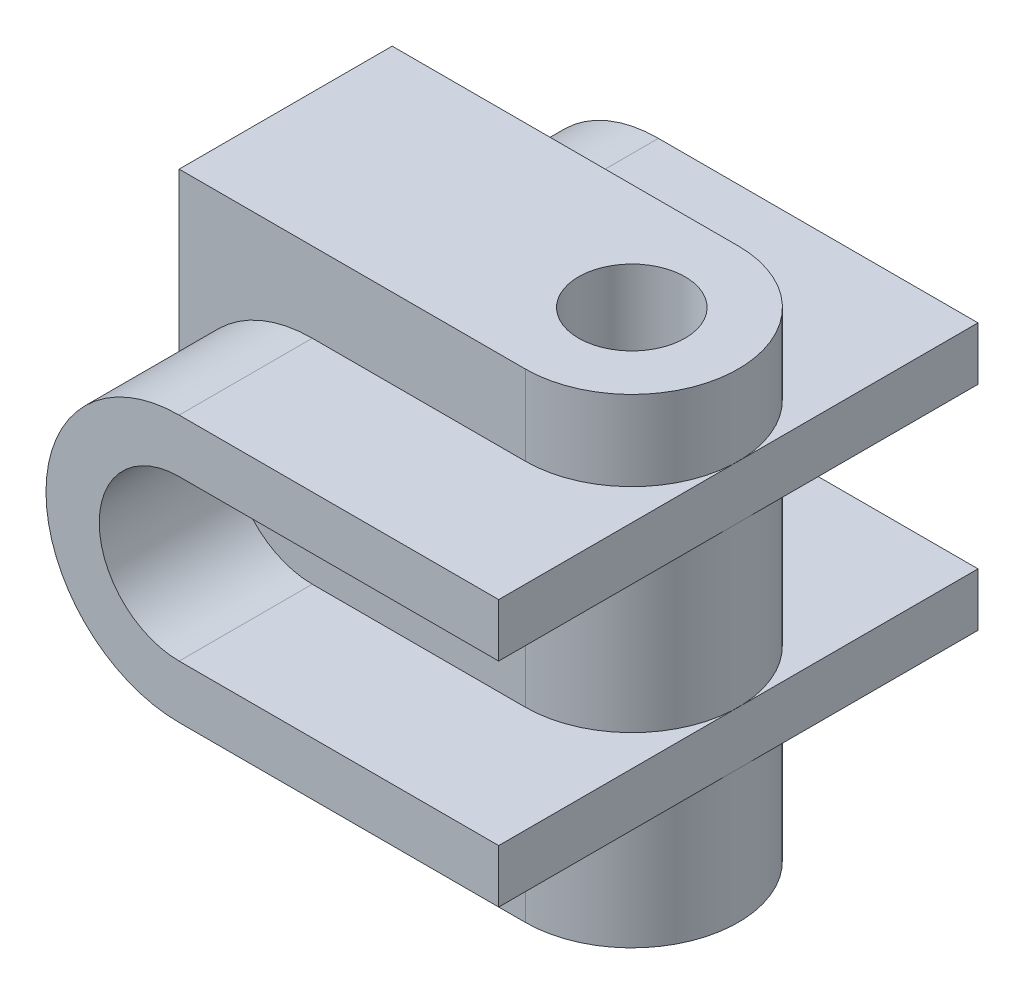
ISO-10303-21;
HEADER;
FILE_DESCRIPTION(('STEP AP214'),'2;1');
FILE_NAME('part.step','',(''),(''),'','','');
FILE_SCHEMA(('AUTOMOTIVE_DESIGN { 1 0 10303 214 1 1 1 1 }'));
ENDSEC;
DATA;
#1=APPLICATION_CONTEXT('core data for automotive mechanical design processes');
#2=APPLICATION_PROTOCOL_DEFINITION('international standard','automotive_design',2000,#1);
#3=PRODUCT_CONTEXT('',#1,'mechanical');
#4=PRODUCT('Part','Part','',(#3));
#5=PRODUCT_RELATED_PRODUCT_CATEGORY('part','',(#4));
#6=PRODUCT_DEFINITION_FORMATION('','',#4);
#7=PRODUCT_DEFINITION_CONTEXT('part definition',#1,'design');
#8=PRODUCT_DEFINITION('design','',#6,#7);
#9=PRODUCT_DEFINITION_SHAPE('','',#8);
#10=(LENGTH_UNIT() NAMED_UNIT(*) SI_UNIT(.MILLI.,.METRE.));
#11=(NAMED_UNIT(*) PLANE_ANGLE_UNIT() SI_UNIT($,.RADIAN.));
#12=(NAMED_UNIT(*) SI_UNIT($,.STERADIAN.) SOLID_ANGLE_UNIT());
#13=UNCERTAINTY_MEASURE_WITH_UNIT(LENGTH_MEASURE(1.E-05),#10,'distance_accuracy_value','');
#14=(GEOMETRIC_REPRESENTATION_CONTEXT(3) GLOBAL_UNCERTAINTY_ASSIGNED_CONTEXT((#13)) GLOBAL_UNIT_ASSIGNED_CONTEXT((#10,
#11,#12)) REPRESENTATION_CONTEXT('',''));
#15=CARTESIAN_POINT('',(0.,0.,0.));
#16=DIRECTION('',(0.,0.,1.));
#17=DIRECTION('',(1.,0.,0.));
#18=AXIS2_PLACEMENT_3D('',#15,#16,#17);
#19=CARTESIAN_POINT('',(-20.,-90.,25.));
#20=DIRECTION('',(0.,0.,-1.));
#21=DIRECTION('',(-1.,0.,0.));
#22=AXIS2_PLACEMENT_3D('',#19,#20,#21);
#23=PLANE('',#22);
#24=DIRECTION('',(-1.,0.,0.));
#25=VECTOR('',#24,1.);
#26=CARTESIAN_POINT('',(-20.,0.,25.));
#27=LINE('',#26,#25);
#28=CARTESIAN_POINT('',(-20.,0.,25.));
#29=VERTEX_POINT('',#28);
#30=CARTESIAN_POINT('',(-85.,0.,25.));
#31=VERTEX_POINT('',#30);
#32=EDGE_CURVE('E90',#29,#31,#27,.T.);
#33=ORIENTED_EDGE('',*,*,#32,.F.);
#34=DIRECTION('',(0.,1.,0.));
#35=VECTOR('',#34,1.);
#36=CARTESIAN_POINT('',(-20.,-90.,25.));
#37=LINE('',#36,#35);
#38=CARTESIAN_POINT('',(-20.,-90.,25.));
#39=VERTEX_POINT('',#38);
#40=EDGE_CURVE('E12',#39,#29,#37,.T.);
#41=ORIENTED_EDGE('',*,*,#40,.F.);
#42=DIRECTION('',(-1.,0.,0.));
#43=VECTOR('',#42,1.);
#44=CARTESIAN_POINT('',(-20.,-90.,25.));
#45=LINE('',#44,#43);
#46=CARTESIAN_POINT('',(-85.,-90.,25.));
#47=VERTEX_POINT('',#46);
#48=EDGE_CURVE('E92',#39,#47,#45,.T.);
#49=ORIENTED_EDGE('',*,*,#48,.T.);
#50=DIRECTION('',(0.,1.,0.));
#51=VECTOR('',#50,1.);
#52=CARTESIAN_POINT('',(-85.,-90.,25.));
#53=LINE('',#52,#51);
#54=EDGE_CURVE('E53',#47,#31,#53,.T.);
#55=ORIENTED_EDGE('',*,*,#54,.T.);
#56=EDGE_LOOP('',(#33,#41,#49,#55));
#57=FACE_BOUND('',#56,.T.);
#58=ADVANCED_FACE('F50',(#57),#23,.T.);
#59=CARTESIAN_POINT('',(-20.,-90.,45.));
#60=DIRECTION('',(0.,1.,0.));
#61=DIRECTION('',(0.,0.,1.));
#62=AXIS2_PLACEMENT_3D('',#59,#60,#61);
#63=CYLINDRICAL_SURFACE('',#62,20.);
#64=CARTESIAN_POINT('',(-20.,0.,45.));
#65=DIRECTION('',(0.,1.,0.));
#66=DIRECTION('',(0.,0.,1.));
#67=AXIS2_PLACEMENT_3D('',#64,#65,#66);
#68=CIRCLE('',#67,20.);
#69=CARTESIAN_POINT('',(-20.,0.,65.));
#70=VERTEX_POINT('',#69);
#71=EDGE_CURVE('E107',#70,#29,#68,.T.);
#72=ORIENTED_EDGE('',*,*,#71,.F.);
#73=DIRECTION('',(0.,1.,0.));
#74=VECTOR('',#73,1.);
#75=CARTESIAN_POINT('',(-20.,-90.,65.));
#76=LINE('',#75,#74);
#77=CARTESIAN_POINT('',(-20.,-90.,65.));
#78=VERTEX_POINT('',#77);
#79=EDGE_CURVE('E58',#78,#70,#76,.T.);
#80=ORIENTED_EDGE('',*,*,#79,.F.);
#81=CARTESIAN_POINT('',(-20.,-90.,45.));
#82=DIRECTION('',(0.,1.,0.));
#83=DIRECTION('',(0.,0.,1.));
#84=AXIS2_PLACEMENT_3D('',#81,#82,#83);
#85=CIRCLE('',#84,20.);
#86=EDGE_CURVE('E97',#78,#39,#85,.T.);
#87=ORIENTED_EDGE('',*,*,#86,.T.);
#88=ORIENTED_EDGE('',*,*,#40,.T.);
#89=EDGE_LOOP('',(#72,#80,#87,#88));
#90=FACE_BOUND('',#89,.T.);
#91=ADVANCED_FACE('F127',(#90),#63,.T.);
#92=CARTESIAN_POINT('',(-85.,-90.,65.));
#93=DIRECTION('',(0.,0.,1.));
#94=DIRECTION('',(1.,0.,0.));
#95=AXIS2_PLACEMENT_3D('',#92,#93,#94);
#96=PLANE('',#95);
#97=DIRECTION('',(1.,0.,0.));
#98=VECTOR('',#97,1.);
#99=CARTESIAN_POINT('',(-85.,0.,65.));
#100=LINE('',#99,#98);
#101=CARTESIAN_POINT('',(-85.,0.,65.));
#102=VERTEX_POINT('',#101);
#103=EDGE_CURVE('E104',#102,#70,#100,.T.);
#104=ORIENTED_EDGE('',*,*,#103,.F.);
#105=DIRECTION('',(0.,1.,0.));
#106=VECTOR('',#105,1.);
#107=CARTESIAN_POINT('',(-85.,-90.,65.));
#108=LINE('',#107,#106);
#109=CARTESIAN_POINT('',(-85.,-90.,65.));
#110=VERTEX_POINT('',#109);
#111=EDGE_CURVE('E96',#110,#102,#108,.T.);
#112=ORIENTED_EDGE('',*,*,#111,.F.);
#113=DIRECTION('',(1.,0.,0.));
#114=VECTOR('',#113,1.);
#115=CARTESIAN_POINT('',(-85.,-90.,65.));
#116=LINE('',#115,#114);
#117=EDGE_CURVE('E120',#110,#78,#116,.T.);
#118=ORIENTED_EDGE('',*,*,#117,.T.);
#119=ORIENTED_EDGE('',*,*,#79,.T.);
#120=EDGE_LOOP('',(#104,#112,#118,#119));
#121=FACE_BOUND('',#120,.T.);
#122=ADVANCED_FACE('F124',(#121),#96,.T.);
#123=CARTESIAN_POINT('',(-85.,-90.,25.));
#124=DIRECTION('',(-1.,0.,0.));
#125=DIRECTION('',(0.,0.,1.));
#126=AXIS2_PLACEMENT_3D('',#123,#124,#125);
#127=PLANE('',#126);
#128=DIRECTION('',(0.,0.,1.));
#129=VECTOR('',#128,1.);
#130=CARTESIAN_POINT('',(-85.,0.,25.));
#131=LINE('',#130,#129);
#132=EDGE_CURVE('E99',#31,#102,#131,.T.);
#133=ORIENTED_EDGE('',*,*,#132,.F.);
#134=ORIENTED_EDGE('',*,*,#54,.F.);
#135=DIRECTION('',(0.,0.,1.));
#136=VECTOR('',#135,1.);
#137=CARTESIAN_POINT('',(-85.,-90.,25.));
#138=LINE('',#137,#136);
#139=EDGE_CURVE('E118',#47,#110,#138,.T.);
#140=ORIENTED_EDGE('',*,*,#139,.T.);
#141=ORIENTED_EDGE('',*,*,#111,.T.);
#142=EDGE_LOOP('',(#133,#134,#140,#141));
#143=FACE_BOUND('',#142,.T.);
#144=ADVANCED_FACE('F100',(#143),#127,.T.);
#145=CARTESIAN_POINT('',(-20.,-90.,45.));
#146=DIRECTION('',(0.,1.,0.));
#147=DIRECTION('',(0.,0.,1.));
#148=AXIS2_PLACEMENT_3D('',#145,#146,#147);
#149=PLANE('',#148);
#150=CARTESIAN_POINT('',(-20.,-90.,45.));
#151=DIRECTION('',(0.,1.,0.));
#152=DIRECTION('',(0.,0.,1.));
#153=AXIS2_PLACEMENT_3D('',#150,#151,#152);
#154=CIRCLE('',#153,10.);
#155=CARTESIAN_POINT('',(-20.,-90.,55.));
#156=VERTEX_POINT('',#155);
#157=EDGE_CURVE('E108',#156,#156,#154,.T.);
#158=ORIENTED_EDGE('',*,*,#157,.T.);
#159=EDGE_LOOP('',(#158));
#160=FACE_BOUND('',#159,.T.);
#161=ORIENTED_EDGE('',*,*,#48,.F.);
#162=ORIENTED_EDGE('',*,*,#86,.F.);
#163=ORIENTED_EDGE('',*,*,#117,.F.);
#164=ORIENTED_EDGE('',*,*,#139,.F.);
#165=EDGE_LOOP('',(#161,#162,#163,#164));
#166=FACE_BOUND('',#165,.T.);
#167=ADVANCED_FACE('F129',(#160,#166),#149,.F.);
#168=CARTESIAN_POINT('',(-20.,0.,45.));
#169=DIRECTION('',(0.,1.,0.));
#170=DIRECTION('',(0.,0.,1.));
#171=AXIS2_PLACEMENT_3D('',#168,#169,#170);
#172=PLANE('',#171);
#173=CARTESIAN_POINT('',(-20.,0.,45.));
#174=DIRECTION('',(0.,1.,0.));
#175=DIRECTION('',(0.,0.,1.));
#176=AXIS2_PLACEMENT_3D('',#173,#174,#175);
#177=CIRCLE('',#176,10.);
#178=CARTESIAN_POINT('',(-20.,0.,55.));
#179=VERTEX_POINT('',#178);
#180=EDGE_CURVE('E111',#179,#179,#177,.T.);
#181=ORIENTED_EDGE('',*,*,#180,.F.);
#182=EDGE_LOOP('',(#181));
#183=FACE_BOUND('',#182,.T.);
#184=ORIENTED_EDGE('',*,*,#32,.T.);
#185=ORIENTED_EDGE('',*,*,#132,.T.);
#186=ORIENTED_EDGE('',*,*,#103,.T.);
#187=ORIENTED_EDGE('',*,*,#71,.T.);
#188=EDGE_LOOP('',(#184,#185,#186,#187));
#189=FACE_BOUND('',#188,.T.);
#190=ADVANCED_FACE('F106',(#183,#189),#172,.T.);
#191=CARTESIAN_POINT('',(-20.,-90.,45.));
#192=DIRECTION('',(0.,1.,0.));
#193=DIRECTION('',(0.,0.,1.));
#194=AXIS2_PLACEMENT_3D('',#191,#192,#193);
#195=CYLINDRICAL_SURFACE('',#194,10.);
#196=CARTESIAN_POINT('',(-20.,-90.,55.));
#197=CARTESIAN_POINT('',(-20.,-89.0625,55.));
#198=CARTESIAN_POINT('',(-20.,-88.125,55.));
#199=CARTESIAN_POINT('',(-20.,-86.25,55.));
#200=CARTESIAN_POINT('',(-20.,-85.3125,55.));
#201=CARTESIAN_POINT('',(-20.,-83.4375,55.));
#202=CARTESIAN_POINT('',(-20.,-82.5,55.));
#203=CARTESIAN_POINT('',(-20.,-80.625,55.));
#204=CARTESIAN_POINT('',(-20.,-79.6875,55.));
#205=CARTESIAN_POINT('',(-20.,-77.8125,55.));
#206=CARTESIAN_POINT('',(-20.,-76.875,55.));
#207=CARTESIAN_POINT('',(-20.,-75.,55.));
#208=CARTESIAN_POINT('',(-20.,-74.0625,55.));
#209=CARTESIAN_POINT('',(-20.,-72.1875,55.));
#210=CARTESIAN_POINT('',(-20.,-71.25,55.));
#211=CARTESIAN_POINT('',(-20.,-69.375,55.));
#212=CARTESIAN_POINT('',(-20.,-68.4375,55.));
#213=CARTESIAN_POINT('',(-20.,-66.5625,55.));
#214=CARTESIAN_POINT('',(-20.,-65.625,55.));
#215=CARTESIAN_POINT('',(-20.,-63.75,55.));
#216=CARTESIAN_POINT('',(-20.,-62.8125,55.));
#217=CARTESIAN_POINT('',(-20.,-60.9375,55.));
#218=CARTESIAN_POINT('',(-20.,-60.,55.));
#219=CARTESIAN_POINT('',(-20.,-58.125,55.));
#220=CARTESIAN_POINT('',(-20.,-57.1875,55.));
#221=CARTESIAN_POINT('',(-20.,-55.3125,55.));
#222=CARTESIAN_POINT('',(-20.,-54.375,55.));
#223=CARTESIAN_POINT('',(-20.,-52.5,55.));
#224=CARTESIAN_POINT('',(-20.,-51.5625,55.));
#225=CARTESIAN_POINT('',(-20.,-49.6875,55.));
#226=CARTESIAN_POINT('',(-20.,-48.75,55.));
#227=CARTESIAN_POINT('',(-20.,-46.875,55.));
#228=CARTESIAN_POINT('',(-20.,-45.9375,55.));
#229=CARTESIAN_POINT('',(-20.,-44.0625,55.));
#230=CARTESIAN_POINT('',(-20.,-43.125,55.));
#231=CARTESIAN_POINT('',(-20.,-41.25,55.));
#232=CARTESIAN_POINT('',(-20.,-40.3125,55.));
#233=CARTESIAN_POINT('',(-20.,-38.4375,55.));
#234=CARTESIAN_POINT('',(-20.,-37.5,55.));
#235=CARTESIAN_POINT('',(-20.,-35.625,55.));
#236=CARTESIAN_POINT('',(-20.,-34.6875,55.));
#237=CARTESIAN_POINT('',(-20.,-32.8125,55.));
#238=CARTESIAN_POINT('',(-20.,-31.875,55.));
#239=CARTESIAN_POINT('',(-20.,-30.,55.));
#240=CARTESIAN_POINT('',(-20.,-29.0625,55.));
#241=CARTESIAN_POINT('',(-20.,-27.1875,55.));
#242=CARTESIAN_POINT('',(-20.,-26.25,55.));
#243=CARTESIAN_POINT('',(-20.,-24.375,55.));
#244=CARTESIAN_POINT('',(-20.,-23.4375,55.));
#245=CARTESIAN_POINT('',(-20.,-21.5625,55.));
#246=CARTESIAN_POINT('',(-20.,-20.625,55.));
#247=CARTESIAN_POINT('',(-20.,-18.75,55.));
#248=CARTESIAN_POINT('',(-20.,-17.8125,55.));
#249=CARTESIAN_POINT('',(-20.,-15.9375,55.));
#250=CARTESIAN_POINT('',(-20.,-15.,55.));
#251=CARTESIAN_POINT('',(-20.,-13.125,55.));
#252=CARTESIAN_POINT('',(-20.,-12.1875,55.));
#253=CARTESIAN_POINT('',(-20.,-10.3125,55.));
#254=CARTESIAN_POINT('',(-20.,-9.37500000000001,55.));
#255=CARTESIAN_POINT('',(-20.,-7.50000000000002,55.));
#256=CARTESIAN_POINT('',(-20.,-6.56250000000002,55.));
#257=CARTESIAN_POINT('',(-20.,-4.68750000000002,55.));
#258=CARTESIAN_POINT('',(-20.,-3.75000000000001,55.));
#259=CARTESIAN_POINT('',(-20.,-1.87500000000001,55.));
#260=CARTESIAN_POINT('',(-20.,-0.937500000000014,55.));
#261=CARTESIAN_POINT('',(-20.,0.,55.));
#262=B_SPLINE_CURVE_WITH_KNOTS('',3,(#196,#197,#198,#199,#200,#201,#202,#203,#204,#205,#206,
#207,#208,#209,#210,#211,#212,#213,#214,#215,#216,#217,#218,#219,#220,#221,#222,#223,#224,#225,
#226,#227,#228,#229,#230,#231,#232,#233,#234,#235,#236,#237,#238,#239,#240,#241,#242,#243,#244,
#245,#246,#247,#248,#249,#250,#251,#252,#253,#254,#255,#256,#257,#258,#259,#260,#261),
.UNSPECIFIED.,.F.,.F.,(4,2,2,2,2,2,2,2,2,2,2,2,2,2,2,2,2,2,2,2,2,2,2,2,2,2,2,2,2,2,2,2,4),(0.,
2.81250000000001,5.62500000000001,8.4375,11.25,14.0625,16.875,19.6875,22.5,25.3125,28.125,
30.9375,33.75,36.5625,39.375,42.1875,45.,47.8125,50.625,53.4375,56.25,59.0625,61.875,64.6875,
67.5,70.3125,73.125,75.9375,78.75,81.5625,84.375,87.1875,90.),.UNSPECIFIED.);
#263=EDGE_CURVE('BSEAM137',#156,#179,#262,.T.);
#264=ORIENTED_EDGE('',*,*,#157,.F.);
#265=ORIENTED_EDGE('',*,*,#180,.T.);
#266=ORIENTED_EDGE('',*,*,#263,.T.);
#267=ORIENTED_EDGE('',*,*,#263,.F.);
#268=EDGE_LOOP('',(#264,#266,#265,#267));
#269=FACE_BOUND('',#268,.T.);
#270=ADVANCED_FACE('F137',(#269),#195,.F.);
#271=CLOSED_SHELL('',(#58,#91,#122,#144,#167,#190,#270));
#272=MANIFOLD_SOLID_BREP('B2',#271);
#273=CARTESIAN_POINT('',(-60.,-65.,90.));
#274=DIRECTION('',(0.,1.,0.));
#275=DIRECTION('',(-1.,0.,0.));
#276=AXIS2_PLACEMENT_3D('',#273,#274,#275);
#277=PLANE('',#276);
#278=DIRECTION('',(1.,0.,0.));
#279=VECTOR('',#278,1.);
#280=CARTESIAN_POINT('',(-60.,-65.,0.));
#281=LINE('',#280,#279);
#282=CARTESIAN_POINT('',(-60.,-65.,0.));
#283=VERTEX_POINT('',#282);
#284=CARTESIAN_POINT('',(0.,-65.,0.));
#285=VERTEX_POINT('',#284);
#286=EDGE_CURVE('E275',#283,#285,#281,.T.);
#287=ORIENTED_EDGE('',*,*,#286,.T.);
#288=DIRECTION('',(0.,0.,-1.));
#289=VECTOR('',#288,1.);
#290=CARTESIAN_POINT('',(0.,-65.,90.));
#291=LINE('',#290,#289);
#292=CARTESIAN_POINT('',(0.,-65.,90.));
#293=VERTEX_POINT('',#292);
#294=EDGE_CURVE('E48',#293,#285,#291,.T.);
#295=ORIENTED_EDGE('',*,*,#294,.F.);
#296=DIRECTION('',(1.,0.,0.));
#297=VECTOR('',#296,1.);
#298=CARTESIAN_POINT('',(-60.,-65.,90.));
#299=LINE('',#298,#297);
#300=CARTESIAN_POINT('',(-60.,-65.,90.));
#301=VERTEX_POINT('',#300);
#302=EDGE_CURVE('E299',#301,#293,#299,.T.);
#303=ORIENTED_EDGE('',*,*,#302,.F.);
#304=DIRECTION('',(0.,0.,-1.));
#305=VECTOR('',#304,1.);
#306=CARTESIAN_POINT('',(-60.,-65.,90.));
#307=LINE('',#306,#305);
#308=EDGE_CURVE('E276',#301,#283,#307,.T.);
#309=ORIENTED_EDGE('',*,*,#308,.T.);
#310=EDGE_LOOP('',(#287,#295,#303,#309));
#311=FACE_BOUND('',#310,.T.);
#312=ADVANCED_FACE('F200',(#311),#277,.F.);
#313=CARTESIAN_POINT('',(0.,-55.,90.));
#314=DIRECTION('',(1.,0.,0.));
#315=DIRECTION('',(0.,1.,0.));
#316=AXIS2_PLACEMENT_3D('',#313,#314,#315);
#317=PLANE('',#316);
#318=DIRECTION('',(0.,-1.,0.));
#319=VECTOR('',#318,1.);
#320=CARTESIAN_POINT('',(0.,-55.,0.));
#321=LINE('',#320,#319);
#322=CARTESIAN_POINT('',(0.,-55.,0.));
#323=VERTEX_POINT('',#322);
#324=EDGE_CURVE('E267',#323,#285,#321,.T.);
#325=ORIENTED_EDGE('',*,*,#324,.F.);
#326=DIRECTION('',(0.,0.,-1.));
#327=VECTOR('',#326,1.);
#328=CARTESIAN_POINT('',(0.,-55.,90.));
#329=LINE('',#328,#327);
#330=CARTESIAN_POINT('',(0.,-55.,90.));
#331=VERTEX_POINT('',#330);
#332=EDGE_CURVE('E207',#331,#323,#329,.T.);
#333=ORIENTED_EDGE('',*,*,#332,.F.);
#334=DIRECTION('',(0.,-1.,0.));
#335=VECTOR('',#334,1.);
#336=CARTESIAN_POINT('',(0.,-55.,90.));
#337=LINE('',#336,#335);
#338=EDGE_CURVE('E270',#331,#293,#337,.T.);
#339=ORIENTED_EDGE('',*,*,#338,.T.);
#340=ORIENTED_EDGE('',*,*,#294,.T.);
#341=EDGE_LOOP('',(#325,#333,#339,#340));
#342=FACE_BOUND('',#341,.T.);
#343=ADVANCED_FACE('F265',(#342),#317,.T.);
#344=CARTESIAN_POINT('',(-60.,-55.,90.));
#345=DIRECTION('',(0.,1.,0.));
#346=DIRECTION('',(-1.,0.,0.));
#347=AXIS2_PLACEMENT_3D('',#344,#345,#346);
#348=PLANE('',#347);
#349=DIRECTION('',(1.,0.,0.));
#350=VECTOR('',#349,1.);
#351=CARTESIAN_POINT('',(-60.,-55.,0.));
#352=LINE('',#351,#350);
#353=CARTESIAN_POINT('',(-60.,-55.,0.));
#354=VERTEX_POINT('',#353);
#355=EDGE_CURVE('E283',#354,#323,#352,.T.);
#356=ORIENTED_EDGE('',*,*,#355,.F.);
#357=DIRECTION('',(0.,0.,-1.));
#358=VECTOR('',#357,1.);
#359=CARTESIAN_POINT('',(-60.,-55.,90.));
#360=LINE('',#359,#358);
#361=CARTESIAN_POINT('',(-60.,-55.,90.));
#362=VERTEX_POINT('',#361);
#363=EDGE_CURVE('E326',#362,#354,#360,.T.);
#364=ORIENTED_EDGE('',*,*,#363,.F.);
#365=DIRECTION('',(1.,0.,0.));
#366=VECTOR('',#365,1.);
#367=CARTESIAN_POINT('',(-60.,-55.,90.));
#368=LINE('',#367,#366);
#369=EDGE_CURVE('E302',#362,#331,#368,.T.);
#370=ORIENTED_EDGE('',*,*,#369,.T.);
#371=ORIENTED_EDGE('',*,*,#332,.T.);
#372=EDGE_LOOP('',(#356,#364,#370,#371));
#373=FACE_BOUND('',#372,.T.);
#374=ADVANCED_FACE('F328',(#373),#348,.T.);
#375=CARTESIAN_POINT('',(-60.,-40.,90.));
#376=DIRECTION('',(0.,0.,-1.));
#377=DIRECTION('',(-1.,0.,0.));
#378=AXIS2_PLACEMENT_3D('',#375,#376,#377);
#379=CYLINDRICAL_SURFACE('',#378,15.);
#380=CARTESIAN_POINT('',(-60.,-40.,0.));
#381=DIRECTION('',(0.,0.,1.));
#382=DIRECTION('',(1.,0.,0.));
#383=AXIS2_PLACEMENT_3D('',#380,#381,#382);
#384=CIRCLE('',#383,15.);
#385=CARTESIAN_POINT('',(-60.,-25.,0.));
#386=VERTEX_POINT('',#385);
#387=EDGE_CURVE('E285',#386,#354,#384,.T.);
#388=ORIENTED_EDGE('',*,*,#387,.F.);
#389=DIRECTION('',(0.,0.,-1.));
#390=VECTOR('',#389,1.);
#391=CARTESIAN_POINT('',(-60.,-25.,90.));
#392=LINE('',#391,#390);
#393=CARTESIAN_POINT('',(-60.,-25.,90.));
#394=VERTEX_POINT('',#393);
#395=EDGE_CURVE('E324',#394,#386,#392,.T.);
#396=ORIENTED_EDGE('',*,*,#395,.F.);
#397=CARTESIAN_POINT('',(-60.,-40.,90.));
#398=DIRECTION('',(0.,0.,1.));
#399=DIRECTION('',(1.,0.,0.));
#400=AXIS2_PLACEMENT_3D('',#397,#398,#399);
#401=CIRCLE('',#400,15.);
#402=EDGE_CURVE('E305',#394,#362,#401,.T.);
#403=ORIENTED_EDGE('',*,*,#402,.T.);
#404=ORIENTED_EDGE('',*,*,#363,.T.);
#405=EDGE_LOOP('',(#388,#396,#403,#404));
#406=FACE_BOUND('',#405,.T.);
#407=ADVANCED_FACE('F335',(#406),#379,.F.);
#408=CARTESIAN_POINT('',(0.,-25.,90.));
#409=DIRECTION('',(0.,-1.,0.));
#410=DIRECTION('',(1.,0.,0.));
#411=AXIS2_PLACEMENT_3D('',#408,#409,#410);
#412=PLANE('',#411);
#413=DIRECTION('',(-1.,0.,0.));
#414=VECTOR('',#413,1.);
#415=CARTESIAN_POINT('',(0.,-25.,0.));
#416=LINE('',#415,#414);
#417=CARTESIAN_POINT('',(0.,-25.,0.));
#418=VERTEX_POINT('',#417);
#419=EDGE_CURVE('E289',#418,#386,#416,.T.);
#420=ORIENTED_EDGE('',*,*,#419,.F.);
#421=DIRECTION('',(0.,0.,-1.));
#422=VECTOR('',#421,1.);
#423=CARTESIAN_POINT('',(0.,-25.,90.));
#424=LINE('',#423,#422);
#425=CARTESIAN_POINT('',(0.,-25.,90.));
#426=VERTEX_POINT('',#425);
#427=EDGE_CURVE('E322',#426,#418,#424,.T.);
#428=ORIENTED_EDGE('',*,*,#427,.F.);
#429=DIRECTION('',(-1.,0.,0.));
#430=VECTOR('',#429,1.);
#431=CARTESIAN_POINT('',(0.,-25.,90.));
#432=LINE('',#431,#430);
#433=EDGE_CURVE('E308',#426,#394,#432,.T.);
#434=ORIENTED_EDGE('',*,*,#433,.T.);
#435=ORIENTED_EDGE('',*,*,#395,.T.);
#436=EDGE_LOOP('',(#420,#428,#434,#435));
#437=FACE_BOUND('',#436,.T.);
#438=ADVANCED_FACE('F338',(#437),#412,.T.);
#439=CARTESIAN_POINT('',(0.,-15.,90.));
#440=DIRECTION('',(1.,0.,0.));
#441=DIRECTION('',(0.,1.,0.));
#442=AXIS2_PLACEMENT_3D('',#439,#440,#441);
#443=PLANE('',#442);
#444=DIRECTION('',(0.,-1.,0.));
#445=VECTOR('',#444,1.);
#446=CARTESIAN_POINT('',(0.,-15.,0.));
#447=LINE('',#446,#445);
#448=CARTESIAN_POINT('',(0.,-15.,0.));
#449=VERTEX_POINT('',#448);
#450=EDGE_CURVE('E292',#449,#418,#447,.T.);
#451=ORIENTED_EDGE('',*,*,#450,.F.);
#452=DIRECTION('',(0.,0.,-1.));
#453=VECTOR('',#452,1.);
#454=CARTESIAN_POINT('',(0.,-15.,90.));
#455=LINE('',#454,#453);
#456=CARTESIAN_POINT('',(0.,-15.,90.));
#457=VERTEX_POINT('',#456);
#458=EDGE_CURVE('E320',#457,#449,#455,.T.);
#459=ORIENTED_EDGE('',*,*,#458,.F.);
#460=DIRECTION('',(0.,-1.,0.));
#461=VECTOR('',#460,1.);
#462=CARTESIAN_POINT('',(0.,-15.,90.));
#463=LINE('',#462,#461);
#464=EDGE_CURVE('E311',#457,#426,#463,.T.);
#465=ORIENTED_EDGE('',*,*,#464,.T.);
#466=ORIENTED_EDGE('',*,*,#427,.T.);
#467=EDGE_LOOP('',(#451,#459,#465,#466));
#468=FACE_BOUND('',#467,.T.);
#469=ADVANCED_FACE('F341',(#468),#443,.T.);
#470=CARTESIAN_POINT('',(0.,-15.,90.));
#471=DIRECTION('',(0.,-1.,0.));
#472=DIRECTION('',(1.,0.,0.));
#473=AXIS2_PLACEMENT_3D('',#470,#471,#472);
#474=PLANE('',#473);
#475=DIRECTION('',(-1.,0.,0.));
#476=VECTOR('',#475,1.);
#477=CARTESIAN_POINT('',(0.,-15.,0.));
#478=LINE('',#477,#476);
#479=CARTESIAN_POINT('',(-60.,-15.,0.));
#480=VERTEX_POINT('',#479);
#481=EDGE_CURVE('E295',#449,#480,#478,.T.);
#482=ORIENTED_EDGE('',*,*,#481,.T.);
#483=DIRECTION('',(0.,0.,-1.));
#484=VECTOR('',#483,1.);
#485=CARTESIAN_POINT('',(-60.,-15.,90.));
#486=LINE('',#485,#484);
#487=CARTESIAN_POINT('',(-60.,-15.,90.));
#488=VERTEX_POINT('',#487);
#489=EDGE_CURVE('E317',#488,#480,#486,.T.);
#490=ORIENTED_EDGE('',*,*,#489,.F.);
#491=DIRECTION('',(-1.,0.,0.));
#492=VECTOR('',#491,1.);
#493=CARTESIAN_POINT('',(0.,-15.,90.));
#494=LINE('',#493,#492);
#495=EDGE_CURVE('E219',#457,#488,#494,.T.);
#496=ORIENTED_EDGE('',*,*,#495,.F.);
#497=ORIENTED_EDGE('',*,*,#458,.T.);
#498=EDGE_LOOP('',(#482,#490,#496,#497));
#499=FACE_BOUND('',#498,.T.);
#500=ADVANCED_FACE('F344',(#499),#474,.F.);
#501=CARTESIAN_POINT('',(-60.,-40.,90.));
#502=DIRECTION('',(0.,0.,-1.));
#503=DIRECTION('',(-1.,0.,0.));
#504=AXIS2_PLACEMENT_3D('',#501,#502,#503);
#505=CYLINDRICAL_SURFACE('',#504,25.);
#506=CARTESIAN_POINT('',(-60.,-40.,0.));
#507=DIRECTION('',(0.,0.,1.));
#508=DIRECTION('',(1.,0.,0.));
#509=AXIS2_PLACEMENT_3D('',#506,#507,#508);
#510=CIRCLE('',#509,25.);
#511=EDGE_CURVE('E297',#480,#283,#510,.T.);
#512=ORIENTED_EDGE('',*,*,#511,.T.);
#513=ORIENTED_EDGE('',*,*,#308,.F.);
#514=CARTESIAN_POINT('',(-60.,-40.,90.));
#515=DIRECTION('',(0.,0.,1.));
#516=DIRECTION('',(1.,0.,0.));
#517=AXIS2_PLACEMENT_3D('',#514,#515,#516);
#518=CIRCLE('',#517,25.);
#519=EDGE_CURVE('E214',#488,#301,#518,.T.);
#520=ORIENTED_EDGE('',*,*,#519,.F.);
#521=ORIENTED_EDGE('',*,*,#489,.T.);
#522=EDGE_LOOP('',(#512,#513,#520,#521));
#523=FACE_BOUND('',#522,.T.);
#524=ADVANCED_FACE('F346',(#523),#505,.T.);
#525=CARTESIAN_POINT('',(-60.,-40.,90.));
#526=DIRECTION('',(0.,0.,1.));
#527=DIRECTION('',(1.,0.,0.));
#528=AXIS2_PLACEMENT_3D('',#525,#526,#527);
#529=PLANE('',#528);
#530=ORIENTED_EDGE('',*,*,#302,.T.);
#531=ORIENTED_EDGE('',*,*,#338,.F.);
#532=ORIENTED_EDGE('',*,*,#369,.F.);
#533=ORIENTED_EDGE('',*,*,#402,.F.);
#534=ORIENTED_EDGE('',*,*,#433,.F.);
#535=ORIENTED_EDGE('',*,*,#464,.F.);
#536=ORIENTED_EDGE('',*,*,#495,.T.);
#537=ORIENTED_EDGE('',*,*,#519,.T.);
#538=EDGE_LOOP('',(#530,#531,#532,#533,#534,#535,#536,#537));
#539=FACE_BOUND('',#538,.T.);
#540=ADVANCED_FACE('F330',(#539),#529,.T.);
#541=CARTESIAN_POINT('',(-60.,-40.,0.));
#542=DIRECTION('',(0.,0.,1.));
#543=DIRECTION('',(1.,0.,0.));
#544=AXIS2_PLACEMENT_3D('',#541,#542,#543);
#545=PLANE('',#544);
#546=ORIENTED_EDGE('',*,*,#286,.F.);
#547=ORIENTED_EDGE('',*,*,#511,.F.);
#548=ORIENTED_EDGE('',*,*,#481,.F.);
#549=ORIENTED_EDGE('',*,*,#450,.T.);
#550=ORIENTED_EDGE('',*,*,#419,.T.);
#551=ORIENTED_EDGE('',*,*,#387,.T.);
#552=ORIENTED_EDGE('',*,*,#355,.T.);
#553=ORIENTED_EDGE('',*,*,#324,.T.);
#554=EDGE_LOOP('',(#546,#547,#548,#549,#550,#551,#552,#553));
#555=FACE_BOUND('',#554,.T.);
#556=ADVANCED_FACE('F280',(#555),#545,.F.);
#557=CLOSED_SHELL('',(#312,#343,#374,#407,#438,#469,#500,#524,#540,#556));
#558=MANIFOLD_SOLID_BREP('B6',#557);
#559=ADVANCED_BREP_SHAPE_REPRESENTATION('',(#18,#272,#558),#14);
#560=SHAPE_DEFINITION_REPRESENTATION(#9,#559);
ENDSEC;
END-ISO-10303-21;
